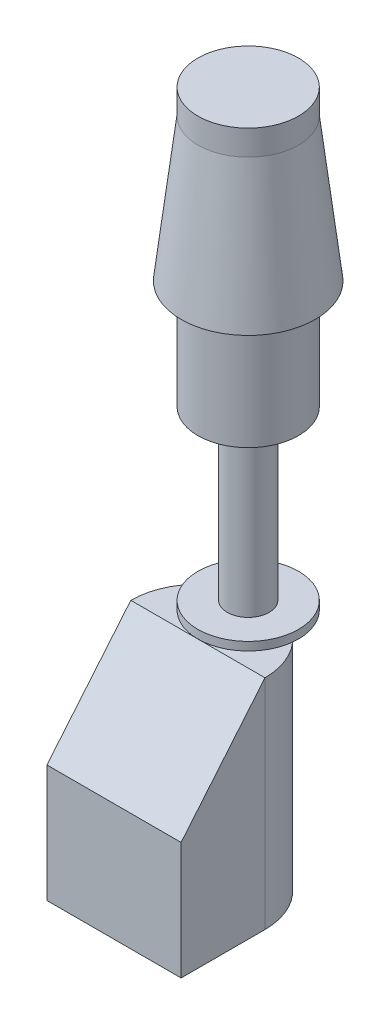
ISO-10303-21;
HEADER;
FILE_DESCRIPTION(('STEP AP214'),'2;1');
FILE_NAME('part.step','',(''),(''),'','','');
FILE_SCHEMA(('AUTOMOTIVE_DESIGN { 1 0 10303 214 1 1 1 1 }'));
ENDSEC;
DATA;
#1=APPLICATION_CONTEXT('core data for automotive mechanical design processes');
#2=APPLICATION_PROTOCOL_DEFINITION('international standard','automotive_design',2000,#1);
#3=PRODUCT_CONTEXT('',#1,'mechanical');
#4=PRODUCT('Part','Part','',(#3));
#5=PRODUCT_RELATED_PRODUCT_CATEGORY('part','',(#4));
#6=PRODUCT_DEFINITION_FORMATION('','',#4);
#7=PRODUCT_DEFINITION_CONTEXT('part definition',#1,'design');
#8=PRODUCT_DEFINITION('design','',#6,#7);
#9=PRODUCT_DEFINITION_SHAPE('','',#8);
#10=(LENGTH_UNIT() NAMED_UNIT(*) SI_UNIT(.MILLI.,.METRE.));
#11=(NAMED_UNIT(*) PLANE_ANGLE_UNIT() SI_UNIT($,.RADIAN.));
#12=(NAMED_UNIT(*) SI_UNIT($,.STERADIAN.) SOLID_ANGLE_UNIT());
#13=UNCERTAINTY_MEASURE_WITH_UNIT(LENGTH_MEASURE(1.E-05),#10,'distance_accuracy_value','');
#14=(GEOMETRIC_REPRESENTATION_CONTEXT(3) GLOBAL_UNCERTAINTY_ASSIGNED_CONTEXT((#13)) GLOBAL_UNIT_ASSIGNED_CONTEXT((#10,
#11,#12)) REPRESENTATION_CONTEXT('',''));
#15=CARTESIAN_POINT('',(0.,0.,0.));
#16=DIRECTION('',(0.,0.,1.));
#17=DIRECTION('',(1.,0.,0.));
#18=AXIS2_PLACEMENT_3D('',#15,#16,#17);
#19=CARTESIAN_POINT('',(0.,-174.625,38.1));
#20=DIRECTION('',(0.,-1.,0.));
#21=DIRECTION('',(0.,0.,-1.));
#22=AXIS2_PLACEMENT_3D('',#19,#20,#21);
#23=PLANE('',#22);
#24=CARTESIAN_POINT('',(0.,-174.625,38.1));
#25=DIRECTION('',(0.,-1.,0.));
#26=DIRECTION('',(0.,0.,-1.));
#27=AXIS2_PLACEMENT_3D('',#24,#25,#26);
#28=CIRCLE('',#27,50.8);
#29=CARTESIAN_POINT('',(-50.8,-174.625,38.1));
#30=VERTEX_POINT('',#29);
#31=CARTESIAN_POINT('',(-37.8640844189964,-174.625,4.23333333333334));
#32=VERTEX_POINT('',#31);
#33=EDGE_CURVE('E51',#30,#32,#28,.T.);
#34=ORIENTED_EDGE('',*,*,#33,.F.);
#35=DIRECTION('',(1.,0.,0.));
#36=VECTOR('',#35,1.);
#37=CARTESIAN_POINT('',(-149.990170884015,-174.625,38.1));
#38=LINE('',#37,#36);
#39=CARTESIAN_POINT('',(0.,-174.625,38.1));
#40=VERTEX_POINT('',#39);
#41=EDGE_CURVE('E114',#30,#40,#38,.T.);
#42=ORIENTED_EDGE('',*,*,#41,.T.);
#43=CARTESIAN_POINT('',(0.,-174.625,0.));
#44=DIRECTION('',(0.,-1.,0.));
#45=DIRECTION('',(0.,0.,-1.));
#46=AXIS2_PLACEMENT_3D('',#43,#44,#45);
#47=CIRCLE('',#46,38.1);
#48=EDGE_CURVE('E59',#40,#32,#47,.T.);
#49=ORIENTED_EDGE('',*,*,#48,.T.);
#50=EDGE_LOOP('',(#34,#42,#49));
#51=FACE_BOUND('',#50,.T.);
#52=ADVANCED_FACE('F39',(#51),#23,.F.);
#53=CARTESIAN_POINT('',(0.,41.275,0.));
#54=DIRECTION('',(0.,-1.,0.));
#55=DIRECTION('',(0.,0.,-1.));
#56=AXIS2_PLACEMENT_3D('',#53,#54,#55);
#57=CYLINDRICAL_SURFACE('',#56,38.1);
#58=CARTESIAN_POINT('',(0.,41.275,0.));
#59=DIRECTION('',(0.,1.,0.));
#60=DIRECTION('',(0.,0.,1.));
#61=AXIS2_PLACEMENT_3D('',#58,#59,#60);
#62=CIRCLE('',#61,38.1);
#63=CARTESIAN_POINT('',(0.,41.275,38.1));
#64=VERTEX_POINT('',#63);
#65=EDGE_CURVE('E148',#64,#64,#62,.T.);
#66=ORIENTED_EDGE('',*,*,#65,.F.);
#67=EDGE_LOOP('',(#66));
#68=FACE_BOUND('',#67,.T.);
#69=CARTESIAN_POINT('',(0.,-41.275,0.));
#70=DIRECTION('',(0.,1.,0.));
#71=DIRECTION('',(0.,0.,1.));
#72=AXIS2_PLACEMENT_3D('',#69,#70,#71);
#73=CIRCLE('',#72,38.1);
#74=CARTESIAN_POINT('',(0.,-41.275,38.1));
#75=VERTEX_POINT('',#74);
#76=EDGE_CURVE('E43',#75,#75,#73,.T.);
#77=ORIENTED_EDGE('',*,*,#76,.T.);
#78=EDGE_LOOP('',(#77));
#79=FACE_BOUND('',#78,.T.);
#80=ADVANCED_FACE('F41',(#68,#79),#57,.T.);
#81=CARTESIAN_POINT('',(0.,-41.275,0.));
#82=DIRECTION('',(0.,1.,0.));
#83=DIRECTION('',(0.,0.,1.));
#84=AXIS2_PLACEMENT_3D('',#81,#82,#83);
#85=PLANE('',#84);
#86=CARTESIAN_POINT('',(0.,-41.275,0.));
#87=DIRECTION('',(0.,-1.,0.));
#88=DIRECTION('',(0.,0.,-1.));
#89=AXIS2_PLACEMENT_3D('',#86,#87,#88);
#90=CIRCLE('',#89,15.875);
#91=CARTESIAN_POINT('',(0.,-41.275,-15.875));
#92=VERTEX_POINT('',#91);
#93=EDGE_CURVE('E49',#92,#92,#90,.T.);
#94=ORIENTED_EDGE('',*,*,#93,.F.);
#95=EDGE_LOOP('',(#94));
#96=FACE_BOUND('',#95,.T.);
#97=ORIENTED_EDGE('',*,*,#76,.F.);
#98=EDGE_LOOP('',(#97));
#99=FACE_BOUND('',#98,.T.);
#100=ADVANCED_FACE('F158',(#96,#99),#85,.F.);
#101=CARTESIAN_POINT('',(0.,-168.275,0.));
#102=DIRECTION('',(0.,1.,0.));
#103=DIRECTION('',(0.,0.,1.));
#104=AXIS2_PLACEMENT_3D('',#101,#102,#103);
#105=CYLINDRICAL_SURFACE('',#104,15.875);
#106=CARTESIAN_POINT('',(0.,-168.275,0.));
#107=DIRECTION('',(0.,-1.,0.));
#108=DIRECTION('',(0.,0.,-1.));
#109=AXIS2_PLACEMENT_3D('',#106,#107,#108);
#110=CIRCLE('',#109,15.875);
#111=CARTESIAN_POINT('',(0.,-168.275,-15.875));
#112=VERTEX_POINT('',#111);
#113=EDGE_CURVE('E141',#112,#112,#110,.T.);
#114=ORIENTED_EDGE('',*,*,#113,.F.);
#115=EDGE_LOOP('',(#114));
#116=FACE_BOUND('',#115,.T.);
#117=ORIENTED_EDGE('',*,*,#93,.T.);
#118=EDGE_LOOP('',(#117));
#119=FACE_BOUND('',#118,.T.);
#120=ADVANCED_FACE('F160',(#116,#119),#105,.T.);
#121=CARTESIAN_POINT('',(0.,-174.625,0.));
#122=DIRECTION('',(0.,1.,0.));
#123=DIRECTION('',(0.,0.,1.));
#124=AXIS2_PLACEMENT_3D('',#121,#122,#123);
#125=CYLINDRICAL_SURFACE('',#124,38.1);
#126=CARTESIAN_POINT('',(37.8640844189964,-174.625,4.23333333333334));
#127=VERTEX_POINT('',#126);
#128=EDGE_CURVE('E66',#127,#40,#47,.T.);
#129=ORIENTED_EDGE('',*,*,#128,.F.);
#130=EDGE_CURVE('E134',#32,#127,#47,.T.);
#131=ORIENTED_EDGE('',*,*,#130,.F.);
#132=ORIENTED_EDGE('',*,*,#48,.F.);
#133=EDGE_LOOP('',(#129,#131,#132));
#134=FACE_BOUND('',#133,.T.);
#135=CARTESIAN_POINT('',(0.,-168.275,0.));
#136=DIRECTION('',(0.,-1.,0.));
#137=DIRECTION('',(0.,0.,-1.));
#138=AXIS2_PLACEMENT_3D('',#135,#136,#137);
#139=CIRCLE('',#138,38.1);
#140=CARTESIAN_POINT('',(0.,-168.275,-38.1));
#141=VERTEX_POINT('',#140);
#142=EDGE_CURVE('E128',#141,#141,#139,.T.);
#143=ORIENTED_EDGE('',*,*,#142,.T.);
#144=EDGE_LOOP('',(#143));
#145=FACE_BOUND('',#144,.T.);
#146=ADVANCED_FACE('F166',(#134,#145),#125,.T.);
#147=CARTESIAN_POINT('',(0.,-174.625,0.));
#148=DIRECTION('',(0.,-1.,0.));
#149=DIRECTION('',(0.,0.,-1.));
#150=AXIS2_PLACEMENT_3D('',#147,#148,#149);
#151=PLANE('',#150);
#152=EDGE_CURVE('E11',#32,#127,#28,.T.);
#153=ORIENTED_EDGE('',*,*,#152,.F.);
#154=ORIENTED_EDGE('',*,*,#130,.T.);
#155=EDGE_LOOP('',(#153,#154));
#156=FACE_BOUND('',#155,.T.);
#157=ADVANCED_FACE('F184',(#156),#151,.T.);
#158=CARTESIAN_POINT('',(0.,-168.275,0.));
#159=DIRECTION('',(0.,-1.,0.));
#160=DIRECTION('',(0.,0.,-1.));
#161=AXIS2_PLACEMENT_3D('',#158,#159,#160);
#162=PLANE('',#161);
#163=ORIENTED_EDGE('',*,*,#113,.T.);
#164=EDGE_LOOP('',(#163));
#165=FACE_BOUND('',#164,.T.);
#166=ORIENTED_EDGE('',*,*,#142,.F.);
#167=EDGE_LOOP('',(#166));
#168=FACE_BOUND('',#167,.T.);
#169=ADVANCED_FACE('F178',(#165,#168),#162,.F.);
#170=ORIENTED_EDGE('',*,*,#128,.T.);
#171=CARTESIAN_POINT('',(50.8,-174.625,38.1));
#172=VERTEX_POINT('',#171);
#173=EDGE_CURVE('E99',#40,#172,#38,.T.);
#174=ORIENTED_EDGE('',*,*,#173,.T.);
#175=EDGE_CURVE('E52',#127,#172,#28,.T.);
#176=ORIENTED_EDGE('',*,*,#175,.F.);
#177=EDGE_LOOP('',(#170,#174,#176));
#178=FACE_BOUND('',#177,.T.);
#179=ADVANCED_FACE('F112',(#178),#23,.F.);
#180=CARTESIAN_POINT('',(0.,-339.725,38.1));
#181=DIRECTION('',(0.,1.,0.));
#182=DIRECTION('',(0.,0.,1.));
#183=AXIS2_PLACEMENT_3D('',#180,#181,#182);
#184=CYLINDRICAL_SURFACE('',#183,50.8);
#185=ORIENTED_EDGE('',*,*,#33,.T.);
#186=ORIENTED_EDGE('',*,*,#152,.T.);
#187=ORIENTED_EDGE('',*,*,#175,.T.);
#188=DIRECTION('',(0.,1.,0.));
#189=VECTOR('',#188,1.);
#190=CARTESIAN_POINT('',(50.8,-339.725,38.1));
#191=LINE('',#190,#189);
#192=CARTESIAN_POINT('',(50.8,-339.725,38.1));
#193=VERTEX_POINT('',#192);
#194=EDGE_CURVE('E121',#193,#172,#191,.T.);
#195=ORIENTED_EDGE('',*,*,#194,.F.);
#196=CARTESIAN_POINT('',(0.,-339.725,38.1));
#197=DIRECTION('',(0.,-1.,0.));
#198=DIRECTION('',(0.,0.,-1.));
#199=AXIS2_PLACEMENT_3D('',#196,#197,#198);
#200=CIRCLE('',#199,50.8);
#201=CARTESIAN_POINT('',(-50.8,-339.725,38.1));
#202=VERTEX_POINT('',#201);
#203=EDGE_CURVE('E293',#202,#193,#200,.T.);
#204=ORIENTED_EDGE('',*,*,#203,.F.);
#205=DIRECTION('',(0.,1.,0.));
#206=VECTOR('',#205,1.);
#207=CARTESIAN_POINT('',(-50.8,-339.725,38.1));
#208=LINE('',#207,#206);
#209=EDGE_CURVE('E303',#202,#30,#208,.T.);
#210=ORIENTED_EDGE('',*,*,#209,.T.);
#211=EDGE_LOOP('',(#185,#186,#187,#195,#204,#210));
#212=FACE_BOUND('',#211,.T.);
#213=ADVANCED_FACE('F119',(#212),#184,.T.);
#214=CARTESIAN_POINT('',(50.8,-339.725,101.6));
#215=DIRECTION('',(-1.,0.,0.));
#216=DIRECTION('',(0.,0.,1.));
#217=AXIS2_PLACEMENT_3D('',#214,#215,#216);
#218=PLANE('',#217);
#219=ORIENTED_EDGE('',*,*,#194,.T.);
#220=DIRECTION('',(0.,0.768221279597376,-0.64018439966448));
#221=VECTOR('',#220,1.);
#222=CARTESIAN_POINT('',(50.8,-250.825,101.6));
#223=LINE('',#222,#221);
#224=CARTESIAN_POINT('',(50.8,-250.825,101.6));
#225=VERTEX_POINT('',#224);
#226=EDGE_CURVE('E96',#225,#172,#223,.T.);
#227=ORIENTED_EDGE('',*,*,#226,.F.);
#228=DIRECTION('',(0.,1.,0.));
#229=VECTOR('',#228,1.);
#230=CARTESIAN_POINT('',(50.8,-339.725,101.6));
#231=LINE('',#230,#229);
#232=CARTESIAN_POINT('',(50.8,-339.725,101.6));
#233=VERTEX_POINT('',#232);
#234=EDGE_CURVE('E129',#233,#225,#231,.T.);
#235=ORIENTED_EDGE('',*,*,#234,.F.);
#236=DIRECTION('',(0.,0.,1.));
#237=VECTOR('',#236,1.);
#238=CARTESIAN_POINT('',(50.8,-339.725,101.6));
#239=LINE('',#238,#237);
#240=EDGE_CURVE('E125',#193,#233,#239,.T.);
#241=ORIENTED_EDGE('',*,*,#240,.F.);
#242=EDGE_LOOP('',(#219,#227,#235,#241));
#243=FACE_BOUND('',#242,.T.);
#244=ADVANCED_FACE('F124',(#243),#218,.F.);
#245=CARTESIAN_POINT('',(-50.8,-339.725,101.6));
#246=DIRECTION('',(0.,0.,-1.));
#247=DIRECTION('',(-1.,0.,0.));
#248=AXIS2_PLACEMENT_3D('',#245,#246,#247);
#249=PLANE('',#248);
#250=ORIENTED_EDGE('',*,*,#234,.T.);
#251=DIRECTION('',(1.,0.,0.));
#252=VECTOR('',#251,1.);
#253=CARTESIAN_POINT('',(-149.990170884015,-250.825,101.6));
#254=LINE('',#253,#252);
#255=CARTESIAN_POINT('',(-50.8,-250.825,101.6));
#256=VERTEX_POINT('',#255);
#257=EDGE_CURVE('E101',#256,#225,#254,.T.);
#258=ORIENTED_EDGE('',*,*,#257,.F.);
#259=DIRECTION('',(0.,1.,0.));
#260=VECTOR('',#259,1.);
#261=CARTESIAN_POINT('',(-50.8,-339.725,101.6));
#262=LINE('',#261,#260);
#263=CARTESIAN_POINT('',(-50.8,-339.725,101.6));
#264=VERTEX_POINT('',#263);
#265=EDGE_CURVE('E136',#264,#256,#262,.T.);
#266=ORIENTED_EDGE('',*,*,#265,.F.);
#267=DIRECTION('',(-1.,0.,0.));
#268=VECTOR('',#267,1.);
#269=CARTESIAN_POINT('',(-50.8,-339.725,101.6));
#270=LINE('',#269,#268);
#271=EDGE_CURVE('E298',#233,#264,#270,.T.);
#272=ORIENTED_EDGE('',*,*,#271,.F.);
#273=EDGE_LOOP('',(#250,#258,#266,#272));
#274=FACE_BOUND('',#273,.T.);
#275=ADVANCED_FACE('F317',(#274),#249,.F.);
#276=CARTESIAN_POINT('',(-50.8,-339.725,38.1));
#277=DIRECTION('',(1.,0.,0.));
#278=DIRECTION('',(0.,0.,-1.));
#279=AXIS2_PLACEMENT_3D('',#276,#277,#278);
#280=PLANE('',#279);
#281=ORIENTED_EDGE('',*,*,#265,.T.);
#282=DIRECTION('',(0.,-0.768221279597376,0.64018439966448));
#283=VECTOR('',#282,1.);
#284=CARTESIAN_POINT('',(-50.8,-250.825,101.6));
#285=LINE('',#284,#283);
#286=EDGE_CURVE('E123',#30,#256,#285,.T.);
#287=ORIENTED_EDGE('',*,*,#286,.F.);
#288=ORIENTED_EDGE('',*,*,#209,.F.);
#289=DIRECTION('',(0.,0.,-1.));
#290=VECTOR('',#289,1.);
#291=CARTESIAN_POINT('',(-50.8,-339.725,38.1));
#292=LINE('',#291,#290);
#293=EDGE_CURVE('E301',#264,#202,#292,.T.);
#294=ORIENTED_EDGE('',*,*,#293,.F.);
#295=EDGE_LOOP('',(#281,#287,#288,#294));
#296=FACE_BOUND('',#295,.T.);
#297=ADVANCED_FACE('F216',(#296),#280,.F.);
#298=CARTESIAN_POINT('',(0.,-339.725,38.1));
#299=DIRECTION('',(0.,-1.,0.));
#300=DIRECTION('',(0.,0.,-1.));
#301=AXIS2_PLACEMENT_3D('',#298,#299,#300);
#302=PLANE('',#301);
#303=ORIENTED_EDGE('',*,*,#203,.T.);
#304=ORIENTED_EDGE('',*,*,#240,.T.);
#305=ORIENTED_EDGE('',*,*,#271,.T.);
#306=ORIENTED_EDGE('',*,*,#293,.T.);
#307=EDGE_LOOP('',(#303,#304,#305,#306));
#308=FACE_BOUND('',#307,.T.);
#309=ADVANCED_FACE('F212',(#308),#302,.T.);
#310=CARTESIAN_POINT('',(-149.990170884015,-250.825,101.6));
#311=DIRECTION('',(0.,-0.64018439966448,-0.768221279597376));
#312=DIRECTION('',(0.,0.768221279597376,-0.64018439966448));
#313=AXIS2_PLACEMENT_3D('',#310,#311,#312);
#314=PLANE('',#313);
#315=ORIENTED_EDGE('',*,*,#286,.T.);
#316=ORIENTED_EDGE('',*,*,#257,.T.);
#317=ORIENTED_EDGE('',*,*,#226,.T.);
#318=ORIENTED_EDGE('',*,*,#173,.F.);
#319=ORIENTED_EDGE('',*,*,#41,.F.);
#320=EDGE_LOOP('',(#315,#316,#317,#318,#319));
#321=FACE_BOUND('',#320,.T.);
#322=ADVANCED_FACE('F98',(#321),#314,.F.);
#323=CARTESIAN_POINT('',(0.,41.275,0.));
#324=DIRECTION('',(0.,1.,0.));
#325=DIRECTION('',(-1.,0.,0.));
#326=AXIS2_PLACEMENT_3D('',#323,#324,#325);
#327=PLANE('',#326);
#328=ORIENTED_EDGE('',*,*,#65,.T.);
#329=EDGE_LOOP('',(#328));
#330=FACE_BOUND('',#329,.T.);
#331=CARTESIAN_POINT('',(0.,41.275,0.));
#332=DIRECTION('',(0.,1.,0.));
#333=DIRECTION('',(-1.,0.,0.));
#334=AXIS2_PLACEMENT_3D('',#331,#332,#333);
#335=CIRCLE('',#334,50.8);
#336=CARTESIAN_POINT('',(-50.8,41.275,0.));
#337=VERTEX_POINT('',#336);
#338=EDGE_CURVE('E107',#337,#337,#335,.T.);
#339=ORIENTED_EDGE('',*,*,#338,.F.);
#340=EDGE_LOOP('',(#339));
#341=FACE_BOUND('',#340,.T.);
#342=ADVANCED_FACE('F233',(#330,#341),#327,.F.);
#343=CARTESIAN_POINT('',(0.,41.275,0.));
#344=DIRECTION('',(0.,-1.,0.));
#345=DIRECTION('',(1.,0.,0.));
#346=AXIS2_PLACEMENT_3D('',#343,#344,#345);
#347=CONICAL_SURFACE('',#346,50.8,0.117108744566864);
#348=CARTESIAN_POINT('',(0.,149.225,0.));
#349=DIRECTION('',(0.,1.,0.));
#350=DIRECTION('',(-1.,0.,0.));
#351=AXIS2_PLACEMENT_3D('',#348,#349,#350);
#352=CIRCLE('',#351,38.1);
#353=CARTESIAN_POINT('',(-38.1,149.225,0.));
#354=VERTEX_POINT('',#353);
#355=EDGE_CURVE('E279',#354,#354,#352,.T.);
#356=ORIENTED_EDGE('',*,*,#355,.F.);
#357=EDGE_LOOP('',(#356));
#358=FACE_BOUND('',#357,.T.);
#359=ORIENTED_EDGE('',*,*,#338,.T.);
#360=EDGE_LOOP('',(#359));
#361=FACE_BOUND('',#360,.T.);
#362=ADVANCED_FACE('F242',(#358,#361),#347,.T.);
#363=CARTESIAN_POINT('',(0.,168.275,0.));
#364=DIRECTION('',(0.,1.,0.));
#365=DIRECTION('',(-1.,0.,0.));
#366=AXIS2_PLACEMENT_3D('',#363,#364,#365);
#367=CYLINDRICAL_SURFACE('',#366,38.1);
#368=CARTESIAN_POINT('',(0.,168.275,0.));
#369=DIRECTION('',(0.,1.,0.));
#370=DIRECTION('',(-1.,0.,0.));
#371=AXIS2_PLACEMENT_3D('',#368,#369,#370);
#372=CIRCLE('',#371,38.1);
#373=CARTESIAN_POINT('',(-38.1,168.275,0.));
#374=VERTEX_POINT('',#373);
#375=EDGE_CURVE('E277',#374,#374,#372,.T.);
#376=ORIENTED_EDGE('',*,*,#375,.F.);
#377=EDGE_LOOP('',(#376));
#378=FACE_BOUND('',#377,.T.);
#379=ORIENTED_EDGE('',*,*,#355,.T.);
#380=EDGE_LOOP('',(#379));
#381=FACE_BOUND('',#380,.T.);
#382=ADVANCED_FACE('F250',(#378,#381),#367,.T.);
#383=CARTESIAN_POINT('',(38.1,168.275,0.));
#384=DIRECTION('',(0.,-1.,0.));
#385=DIRECTION('',(1.,0.,0.));
#386=AXIS2_PLACEMENT_3D('',#383,#384,#385);
#387=PLANE('',#386);
#388=ORIENTED_EDGE('',*,*,#375,.T.);
#389=EDGE_LOOP('',(#388));
#390=FACE_BOUND('',#389,.T.);
#391=ADVANCED_FACE('F259',(#390),#387,.F.);
#392=CLOSED_SHELL('',(#52,#80,#100,#120,#146,#157,#169,#179,#213,#244,#275,#297,#309,#322,#342,
#362,#382,#391));
#393=MANIFOLD_SOLID_BREP('B2',#392);
#394=ADVANCED_BREP_SHAPE_REPRESENTATION('',(#18,#393),#14);
#395=SHAPE_DEFINITION_REPRESENTATION(#9,#394);
ENDSEC;
END-ISO-10303-21;
